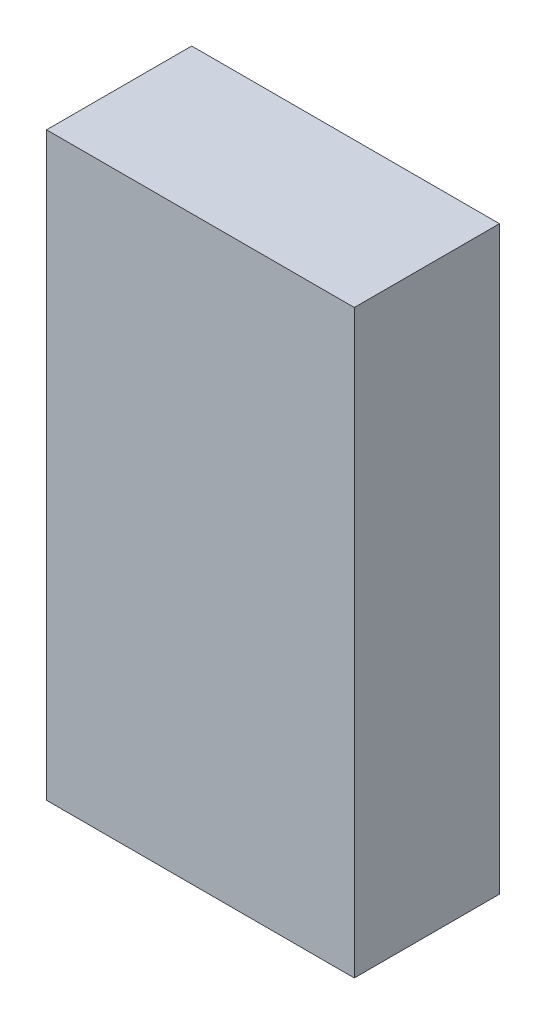
ISO-10303-21;
HEADER;
FILE_DESCRIPTION(('STEP AP214'),'2;1');
FILE_NAME('part.step','',(''),(''),'','','');
FILE_SCHEMA(('AUTOMOTIVE_DESIGN { 1 0 10303 214 1 1 1 1 }'));
ENDSEC;
DATA;
#1=APPLICATION_CONTEXT('core data for automotive mechanical design processes');
#2=APPLICATION_PROTOCOL_DEFINITION('international standard','automotive_design',2000,#1);
#3=PRODUCT_CONTEXT('',#1,'mechanical');
#4=PRODUCT('Part','Part','',(#3));
#5=PRODUCT_RELATED_PRODUCT_CATEGORY('part','',(#4));
#6=PRODUCT_DEFINITION_FORMATION('','',#4);
#7=PRODUCT_DEFINITION_CONTEXT('part definition',#1,'design');
#8=PRODUCT_DEFINITION('design','',#6,#7);
#9=PRODUCT_DEFINITION_SHAPE('','',#8);
#10=(LENGTH_UNIT() NAMED_UNIT(*) SI_UNIT(.MILLI.,.METRE.));
#11=(NAMED_UNIT(*) PLANE_ANGLE_UNIT() SI_UNIT($,.RADIAN.));
#12=(NAMED_UNIT(*) SI_UNIT($,.STERADIAN.) SOLID_ANGLE_UNIT());
#13=UNCERTAINTY_MEASURE_WITH_UNIT(LENGTH_MEASURE(1.E-05),#10,'distance_accuracy_value','');
#14=(GEOMETRIC_REPRESENTATION_CONTEXT(3) GLOBAL_UNCERTAINTY_ASSIGNED_CONTEXT((#13)) GLOBAL_UNIT_ASSIGNED_CONTEXT((#10,
#11,#12)) REPRESENTATION_CONTEXT('',''));
#15=CARTESIAN_POINT('',(0.,0.,0.));
#16=DIRECTION('',(0.,0.,1.));
#17=DIRECTION('',(1.,0.,0.));
#18=AXIS2_PLACEMENT_3D('',#15,#16,#17);
#19=CARTESIAN_POINT('',(52.9999999999999,200.,-22.5));
#20=DIRECTION('',(-1.,0.,0.));
#21=DIRECTION('',(0.,0.,1.));
#22=AXIS2_PLACEMENT_3D('',#19,#20,#21);
#23=PLANE('',#22);
#24=DIRECTION('',(0.,0.,-1.));
#25=VECTOR('',#24,1.);
#26=CARTESIAN_POINT('',(52.9999999999999,0.,-22.5));
#27=LINE('',#26,#25);
#28=CARTESIAN_POINT('',(53.,0.,27.5));
#29=VERTEX_POINT('',#28);
#30=CARTESIAN_POINT('',(52.9999999999999,0.,-22.5));
#31=VERTEX_POINT('',#30);
#32=EDGE_CURVE('E139',#29,#31,#27,.T.);
#33=ORIENTED_EDGE('',*,*,#32,.T.);
#34=DIRECTION('',(0.,-1.,0.));
#35=VECTOR('',#34,1.);
#36=CARTESIAN_POINT('',(52.9999999999999,200.,-22.5));
#37=LINE('',#36,#35);
#38=CARTESIAN_POINT('',(52.9999999999999,200.,-22.5));
#39=VERTEX_POINT('',#38);
#40=EDGE_CURVE('E232',#39,#31,#37,.T.);
#41=ORIENTED_EDGE('',*,*,#40,.F.);
#42=DIRECTION('',(0.,0.,-1.));
#43=VECTOR('',#42,1.);
#44=CARTESIAN_POINT('',(52.9999999999999,200.,-22.5));
#45=LINE('',#44,#43);
#46=CARTESIAN_POINT('',(53.,200.,27.5));
#47=VERTEX_POINT('',#46);
#48=EDGE_CURVE('E132',#47,#39,#45,.T.);
#49=ORIENTED_EDGE('',*,*,#48,.F.);
#50=DIRECTION('',(0.,1.,0.));
#51=VECTOR('',#50,1.);
#52=CARTESIAN_POINT('',(53.,200.,27.5));
#53=LINE('',#52,#51);
#54=EDGE_CURVE('E143',#29,#47,#53,.T.);
#55=ORIENTED_EDGE('',*,*,#54,.F.);
#56=EDGE_LOOP('',(#33,#41,#49,#55));
#57=FACE_BOUND('',#56,.T.);
#58=ADVANCED_FACE('F33',(#57),#23,.F.);
#59=CARTESIAN_POINT('',(-53.0000000000001,200.,-22.5));
#60=DIRECTION('',(0.,0.,1.));
#61=DIRECTION('',(1.,0.,0.));
#62=AXIS2_PLACEMENT_3D('',#59,#60,#61);
#63=PLANE('',#62);
#64=CARTESIAN_POINT('',(-1.69657033206363,150.301958836192,-22.5));
#65=DIRECTION('',(0.,0.,1.));
#66=DIRECTION('',(1.,0.,0.));
#67=AXIS2_PLACEMENT_3D('',#64,#65,#66);
#68=CIRCLE('',#67,7.5);
#69=CARTESIAN_POINT('',(5.80342966793638,150.301958836192,-22.5));
#70=VERTEX_POINT('',#69);
#71=EDGE_CURVE('E170',#70,#70,#68,.T.);
#72=ORIENTED_EDGE('',*,*,#71,.T.);
#73=EDGE_LOOP('',(#72));
#74=FACE_BOUND('',#73,.T.);
#75=CARTESIAN_POINT('',(23.3034296679364,150.301958836192,-22.5));
#76=DIRECTION('',(0.,0.,1.));
#77=DIRECTION('',(1.,0.,0.));
#78=AXIS2_PLACEMENT_3D('',#75,#76,#77);
#79=CIRCLE('',#78,7.5);
#80=CARTESIAN_POINT('',(30.8034296679364,150.301958836192,-22.5));
#81=VERTEX_POINT('',#80);
#82=EDGE_CURVE('E177',#81,#81,#79,.T.);
#83=ORIENTED_EDGE('',*,*,#82,.T.);
#84=EDGE_LOOP('',(#83));
#85=FACE_BOUND('',#84,.T.);
#86=CARTESIAN_POINT('',(-26.6965703320636,150.301958836192,-22.5));
#87=DIRECTION('',(0.,0.,1.));
#88=DIRECTION('',(1.,0.,0.));
#89=AXIS2_PLACEMENT_3D('',#86,#87,#88);
#90=CIRCLE('',#89,7.5);
#91=CARTESIAN_POINT('',(-19.1965703320636,150.301958836192,-22.5));
#92=VERTEX_POINT('',#91);
#93=EDGE_CURVE('E182',#92,#92,#90,.T.);
#94=ORIENTED_EDGE('',*,*,#93,.T.);
#95=EDGE_LOOP('',(#94));
#96=FACE_BOUND('',#95,.T.);
#97=DIRECTION('',(-1.,0.,0.));
#98=VECTOR('',#97,1.);
#99=CARTESIAN_POINT('',(-53.0000000000001,0.,-22.5));
#100=LINE('',#99,#98);
#101=CARTESIAN_POINT('',(-53.0000000000001,0.,-22.5));
#102=VERTEX_POINT('',#101);
#103=EDGE_CURVE('E133',#31,#102,#100,.T.);
#104=ORIENTED_EDGE('',*,*,#103,.T.);
#105=DIRECTION('',(0.,-1.,0.));
#106=VECTOR('',#105,1.);
#107=CARTESIAN_POINT('',(-53.0000000000001,200.,-22.5));
#108=LINE('',#107,#106);
#109=CARTESIAN_POINT('',(-53.0000000000001,200.,-22.5));
#110=VERTEX_POINT('',#109);
#111=EDGE_CURVE('E130',#110,#102,#108,.T.);
#112=ORIENTED_EDGE('',*,*,#111,.F.);
#113=DIRECTION('',(-1.,0.,0.));
#114=VECTOR('',#113,1.);
#115=CARTESIAN_POINT('',(-53.0000000000001,200.,-22.5));
#116=LINE('',#115,#114);
#117=EDGE_CURVE('E225',#39,#110,#116,.T.);
#118=ORIENTED_EDGE('',*,*,#117,.F.);
#119=ORIENTED_EDGE('',*,*,#40,.T.);
#120=EDGE_LOOP('',(#104,#112,#118,#119));
#121=FACE_BOUND('',#120,.T.);
#122=ADVANCED_FACE('F269',(#74,#85,#96,#121),#63,.F.);
#123=CARTESIAN_POINT('',(-53.0000000000001,200.,-22.5));
#124=DIRECTION('',(1.,0.,0.));
#125=DIRECTION('',(0.,0.,-1.));
#126=AXIS2_PLACEMENT_3D('',#123,#124,#125);
#127=PLANE('',#126);
#128=DIRECTION('',(0.,0.,1.));
#129=VECTOR('',#128,1.);
#130=CARTESIAN_POINT('',(-53.0000000000001,0.,-22.5));
#131=LINE('',#130,#129);
#132=CARTESIAN_POINT('',(-53.,0.,27.5));
#133=VERTEX_POINT('',#132);
#134=EDGE_CURVE('E123',#102,#133,#131,.T.);
#135=ORIENTED_EDGE('',*,*,#134,.T.);
#136=DIRECTION('',(0.,-1.,0.));
#137=VECTOR('',#136,1.);
#138=CARTESIAN_POINT('',(-53.,200.,27.5));
#139=LINE('',#138,#137);
#140=CARTESIAN_POINT('',(-53.,200.,27.5));
#141=VERTEX_POINT('',#140);
#142=EDGE_CURVE('E128',#141,#133,#139,.T.);
#143=ORIENTED_EDGE('',*,*,#142,.F.);
#144=DIRECTION('',(0.,0.,1.));
#145=VECTOR('',#144,1.);
#146=CARTESIAN_POINT('',(-53.0000000000001,200.,-22.5));
#147=LINE('',#146,#145);
#148=EDGE_CURVE('E227',#110,#141,#147,.T.);
#149=ORIENTED_EDGE('',*,*,#148,.F.);
#150=ORIENTED_EDGE('',*,*,#111,.T.);
#151=EDGE_LOOP('',(#135,#143,#149,#150));
#152=FACE_BOUND('',#151,.T.);
#153=ADVANCED_FACE('F125',(#152),#127,.F.);
#154=CARTESIAN_POINT('',(0.,200.,0.));
#155=DIRECTION('',(0.,1.,0.));
#156=DIRECTION('',(0.,0.,1.));
#157=AXIS2_PLACEMENT_3D('',#154,#155,#156);
#158=PLANE('',#157);
#159=ORIENTED_EDGE('',*,*,#48,.T.);
#160=ORIENTED_EDGE('',*,*,#117,.T.);
#161=ORIENTED_EDGE('',*,*,#148,.T.);
#162=DIRECTION('',(-1.,0.,0.));
#163=VECTOR('',#162,1.);
#164=CARTESIAN_POINT('',(-53.,200.,27.5));
#165=LINE('',#164,#163);
#166=EDGE_CURVE('E148',#47,#141,#165,.T.);
#167=ORIENTED_EDGE('',*,*,#166,.F.);
#168=EDGE_LOOP('',(#159,#160,#161,#167));
#169=FACE_BOUND('',#168,.T.);
#170=ADVANCED_FACE('F279',(#169),#158,.T.);
#171=CARTESIAN_POINT('',(0.,0.,0.));
#172=DIRECTION('',(0.,1.,0.));
#173=DIRECTION('',(0.,0.,1.));
#174=AXIS2_PLACEMENT_3D('',#171,#172,#173);
#175=PLANE('',#174);
#176=DIRECTION('',(1.,0.,0.));
#177=VECTOR('',#176,1.);
#178=CARTESIAN_POINT('',(-33.0000000000001,0.,7.29204172876375));
#179=LINE('',#178,#177);
#180=CARTESIAN_POINT('',(-33.0000000000001,0.,7.29204172876375));
#181=VERTEX_POINT('',#180);
#182=CARTESIAN_POINT('',(-8.96940793930368,0.,7.29204172876375));
#183=VERTEX_POINT('',#182);
#184=EDGE_CURVE('E154',#181,#183,#179,.T.);
#185=ORIENTED_EDGE('',*,*,#184,.F.);
#186=DIRECTION('',(0.,0.,-1.));
#187=VECTOR('',#186,1.);
#188=CARTESIAN_POINT('',(-33.0000000000001,0.,14.5));
#189=LINE('',#188,#187);
#190=CARTESIAN_POINT('',(-33.0000000000001,0.,14.5));
#191=VERTEX_POINT('',#190);
#192=EDGE_CURVE('E47',#191,#181,#189,.T.);
#193=ORIENTED_EDGE('',*,*,#192,.F.);
#194=DIRECTION('',(-1.,0.,0.));
#195=VECTOR('',#194,1.);
#196=CARTESIAN_POINT('',(-33.0000000000001,0.,14.5));
#197=LINE('',#196,#195);
#198=CARTESIAN_POINT('',(-8.96940793930368,0.,14.5));
#199=VERTEX_POINT('',#198);
#200=EDGE_CURVE('E159',#199,#191,#197,.T.);
#201=ORIENTED_EDGE('',*,*,#200,.F.);
#202=DIRECTION('',(0.,0.,1.));
#203=VECTOR('',#202,1.);
#204=CARTESIAN_POINT('',(-8.96940793930368,0.,14.5));
#205=LINE('',#204,#203);
#206=EDGE_CURVE('E156',#183,#199,#205,.T.);
#207=ORIENTED_EDGE('',*,*,#206,.F.);
#208=EDGE_LOOP('',(#185,#193,#201,#207));
#209=FACE_BOUND('',#208,.T.);
#210=ORIENTED_EDGE('',*,*,#32,.F.);
#211=DIRECTION('',(1.,0.,0.));
#212=VECTOR('',#211,1.);
#213=CARTESIAN_POINT('',(-53.,0.,27.5));
#214=LINE('',#213,#212);
#215=EDGE_CURVE('E136',#133,#29,#214,.T.);
#216=ORIENTED_EDGE('',*,*,#215,.F.);
#217=ORIENTED_EDGE('',*,*,#134,.F.);
#218=ORIENTED_EDGE('',*,*,#103,.F.);
#219=EDGE_LOOP('',(#210,#216,#217,#218));
#220=FACE_BOUND('',#219,.T.);
#221=ADVANCED_FACE('F137',(#209,#220),#175,.F.);
#222=CARTESIAN_POINT('',(-43.,190.,-12.4999999999999));
#223=DIRECTION('',(-1.,0.,0.));
#224=DIRECTION('',(0.,-1.,0.));
#225=AXIS2_PLACEMENT_3D('',#222,#223,#224);
#226=PLANE('',#225);
#227=DIRECTION('',(0.,-1.,0.));
#228=VECTOR('',#227,1.);
#229=CARTESIAN_POINT('',(-43.,190.,22.5));
#230=LINE('',#229,#228);
#231=CARTESIAN_POINT('',(-43.,190.,22.5));
#232=VERTEX_POINT('',#231);
#233=CARTESIAN_POINT('',(-43.,10.,22.5));
#234=VERTEX_POINT('',#233);
#235=EDGE_CURVE('E185',#232,#234,#230,.T.);
#236=ORIENTED_EDGE('',*,*,#235,.T.);
#237=DIRECTION('',(0.,0.,1.));
#238=VECTOR('',#237,1.);
#239=CARTESIAN_POINT('',(-43.,10.,-12.4999999999999));
#240=LINE('',#239,#238);
#241=CARTESIAN_POINT('',(-43.,10.,-12.4999999999999));
#242=VERTEX_POINT('',#241);
#243=EDGE_CURVE('E201',#242,#234,#240,.T.);
#244=ORIENTED_EDGE('',*,*,#243,.F.);
#245=DIRECTION('',(0.,-1.,0.));
#246=VECTOR('',#245,1.);
#247=CARTESIAN_POINT('',(-43.,190.,-12.4999999999999));
#248=LINE('',#247,#246);
#249=CARTESIAN_POINT('',(-43.,190.,-12.4999999999999));
#250=VERTEX_POINT('',#249);
#251=EDGE_CURVE('E188',#250,#242,#248,.T.);
#252=ORIENTED_EDGE('',*,*,#251,.F.);
#253=DIRECTION('',(0.,0.,1.));
#254=VECTOR('',#253,1.);
#255=CARTESIAN_POINT('',(-43.,190.,-12.4999999999999));
#256=LINE('',#255,#254);
#257=EDGE_CURVE('E212',#250,#232,#256,.T.);
#258=ORIENTED_EDGE('',*,*,#257,.T.);
#259=EDGE_LOOP('',(#236,#244,#252,#258));
#260=FACE_BOUND('',#259,.T.);
#261=ADVANCED_FACE('F286',(#260),#226,.F.);
#262=CARTESIAN_POINT('',(-43.,190.,-12.4999999999999));
#263=DIRECTION('',(0.,1.,0.));
#264=DIRECTION('',(0.,0.,1.));
#265=AXIS2_PLACEMENT_3D('',#262,#263,#264);
#266=PLANE('',#265);
#267=DIRECTION('',(-1.,0.,0.));
#268=VECTOR('',#267,1.);
#269=CARTESIAN_POINT('',(-43.,190.,22.5));
#270=LINE('',#269,#268);
#271=CARTESIAN_POINT('',(43.,190.,22.5));
#272=VERTEX_POINT('',#271);
#273=EDGE_CURVE('E192',#272,#232,#270,.T.);
#274=ORIENTED_EDGE('',*,*,#273,.T.);
#275=ORIENTED_EDGE('',*,*,#257,.F.);
#276=DIRECTION('',(-1.,0.,0.));
#277=VECTOR('',#276,1.);
#278=CARTESIAN_POINT('',(-43.,190.,-12.4999999999999));
#279=LINE('',#278,#277);
#280=CARTESIAN_POINT('',(43.,190.,-12.4999999999999));
#281=VERTEX_POINT('',#280);
#282=EDGE_CURVE('E198',#281,#250,#279,.T.);
#283=ORIENTED_EDGE('',*,*,#282,.F.);
#284=DIRECTION('',(0.,0.,1.));
#285=VECTOR('',#284,1.);
#286=CARTESIAN_POINT('',(43.,190.,-12.4999999999999));
#287=LINE('',#286,#285);
#288=EDGE_CURVE('E215',#281,#272,#287,.T.);
#289=ORIENTED_EDGE('',*,*,#288,.T.);
#290=EDGE_LOOP('',(#274,#275,#283,#289));
#291=FACE_BOUND('',#290,.T.);
#292=ADVANCED_FACE('F292',(#291),#266,.F.);
#293=CARTESIAN_POINT('',(43.,190.,-12.4999999999999));
#294=DIRECTION('',(1.,0.,0.));
#295=DIRECTION('',(0.,1.,0.));
#296=AXIS2_PLACEMENT_3D('',#293,#294,#295);
#297=PLANE('',#296);
#298=DIRECTION('',(0.,1.,0.));
#299=VECTOR('',#298,1.);
#300=CARTESIAN_POINT('',(43.,190.,22.5));
#301=LINE('',#300,#299);
#302=CARTESIAN_POINT('',(43.,10.,22.5));
#303=VERTEX_POINT('',#302);
#304=EDGE_CURVE('E207',#303,#272,#301,.T.);
#305=ORIENTED_EDGE('',*,*,#304,.T.);
#306=ORIENTED_EDGE('',*,*,#288,.F.);
#307=DIRECTION('',(0.,1.,0.));
#308=VECTOR('',#307,1.);
#309=CARTESIAN_POINT('',(43.,190.,-12.4999999999999));
#310=LINE('',#309,#308);
#311=CARTESIAN_POINT('',(43.,10.,-12.4999999999999));
#312=VERTEX_POINT('',#311);
#313=EDGE_CURVE('E195',#312,#281,#310,.T.);
#314=ORIENTED_EDGE('',*,*,#313,.F.);
#315=DIRECTION('',(0.,0.,1.));
#316=VECTOR('',#315,1.);
#317=CARTESIAN_POINT('',(43.,10.,-12.4999999999999));
#318=LINE('',#317,#316);
#319=EDGE_CURVE('E218',#312,#303,#318,.T.);
#320=ORIENTED_EDGE('',*,*,#319,.T.);
#321=EDGE_LOOP('',(#305,#306,#314,#320));
#322=FACE_BOUND('',#321,.T.);
#323=ADVANCED_FACE('F297',(#322),#297,.F.);
#324=CARTESIAN_POINT('',(-43.,10.,-12.4999999999999));
#325=DIRECTION('',(0.,-1.,0.));
#326=DIRECTION('',(0.,0.,-1.));
#327=AXIS2_PLACEMENT_3D('',#324,#325,#326);
#328=PLANE('',#327);
#329=DIRECTION('',(-1.,0.,0.));
#330=VECTOR('',#329,1.);
#331=CARTESIAN_POINT('',(-43.,10.,14.5));
#332=LINE('',#331,#330);
#333=CARTESIAN_POINT('',(-8.96940793930368,10.,14.5));
#334=VERTEX_POINT('',#333);
#335=CARTESIAN_POINT('',(-33.0000000000001,10.,14.5));
#336=VERTEX_POINT('',#335);
#337=EDGE_CURVE('E40',#334,#336,#332,.T.);
#338=ORIENTED_EDGE('',*,*,#337,.T.);
#339=DIRECTION('',(0.,0.,-1.));
#340=VECTOR('',#339,1.);
#341=CARTESIAN_POINT('',(-33.0000000000001,10.,-12.4999999999999));
#342=LINE('',#341,#340);
#343=CARTESIAN_POINT('',(-33.0000000000001,10.,7.29204172876375));
#344=VERTEX_POINT('',#343);
#345=EDGE_CURVE('E11',#336,#344,#342,.T.);
#346=ORIENTED_EDGE('',*,*,#345,.T.);
#347=DIRECTION('',(1.,0.,0.));
#348=VECTOR('',#347,1.);
#349=CARTESIAN_POINT('',(-43.,10.,7.29204172876375));
#350=LINE('',#349,#348);
#351=CARTESIAN_POINT('',(-8.96940793930368,10.,7.29204172876375));
#352=VERTEX_POINT('',#351);
#353=EDGE_CURVE('E235',#344,#352,#350,.T.);
#354=ORIENTED_EDGE('',*,*,#353,.T.);
#355=DIRECTION('',(0.,0.,1.));
#356=VECTOR('',#355,1.);
#357=CARTESIAN_POINT('',(-8.96940793930368,10.,-12.4999999999999));
#358=LINE('',#357,#356);
#359=EDGE_CURVE('E238',#352,#334,#358,.T.);
#360=ORIENTED_EDGE('',*,*,#359,.T.);
#361=EDGE_LOOP('',(#338,#346,#354,#360));
#362=FACE_BOUND('',#361,.T.);
#363=DIRECTION('',(1.,0.,0.));
#364=VECTOR('',#363,1.);
#365=CARTESIAN_POINT('',(-43.,10.,22.5));
#366=LINE('',#365,#364);
#367=EDGE_CURVE('E204',#234,#303,#366,.T.);
#368=ORIENTED_EDGE('',*,*,#367,.T.);
#369=ORIENTED_EDGE('',*,*,#319,.F.);
#370=DIRECTION('',(1.,0.,0.));
#371=VECTOR('',#370,1.);
#372=CARTESIAN_POINT('',(-43.,10.,-12.4999999999999));
#373=LINE('',#372,#371);
#374=EDGE_CURVE('E191',#242,#312,#373,.T.);
#375=ORIENTED_EDGE('',*,*,#374,.F.);
#376=ORIENTED_EDGE('',*,*,#243,.T.);
#377=EDGE_LOOP('',(#368,#369,#375,#376));
#378=FACE_BOUND('',#377,.T.);
#379=ADVANCED_FACE('F242',(#362,#378),#328,.F.);
#380=CARTESIAN_POINT('',(0.,0.,-12.4999999999999));
#381=DIRECTION('',(0.,0.,1.));
#382=DIRECTION('',(1.,0.,0.));
#383=AXIS2_PLACEMENT_3D('',#380,#381,#382);
#384=PLANE('',#383);
#385=CARTESIAN_POINT('',(-1.69657033206363,150.301958836192,-12.4999999999999));
#386=DIRECTION('',(0.,0.,1.));
#387=DIRECTION('',(1.,0.,0.));
#388=AXIS2_PLACEMENT_3D('',#385,#386,#387);
#389=CIRCLE('',#388,7.5);
#390=CARTESIAN_POINT('',(5.80342966793638,150.301958836192,-12.4999999999999));
#391=VERTEX_POINT('',#390);
#392=EDGE_CURVE('E174',#391,#391,#389,.T.);
#393=ORIENTED_EDGE('',*,*,#392,.F.);
#394=EDGE_LOOP('',(#393));
#395=FACE_BOUND('',#394,.T.);
#396=CARTESIAN_POINT('',(23.3034296679364,150.301958836192,-12.4999999999999));
#397=DIRECTION('',(0.,0.,1.));
#398=DIRECTION('',(1.,0.,0.));
#399=AXIS2_PLACEMENT_3D('',#396,#397,#398);
#400=CIRCLE('',#399,7.5);
#401=CARTESIAN_POINT('',(30.8034296679364,150.301958836192,-12.4999999999999));
#402=VERTEX_POINT('',#401);
#403=EDGE_CURVE('E165',#402,#402,#400,.T.);
#404=ORIENTED_EDGE('',*,*,#403,.F.);
#405=EDGE_LOOP('',(#404));
#406=FACE_BOUND('',#405,.T.);
#407=CARTESIAN_POINT('',(-26.6965703320636,150.301958836192,-12.4999999999999));
#408=DIRECTION('',(0.,0.,1.));
#409=DIRECTION('',(1.,0.,0.));
#410=AXIS2_PLACEMENT_3D('',#407,#408,#409);
#411=CIRCLE('',#410,7.5);
#412=CARTESIAN_POINT('',(-19.1965703320636,150.301958836192,-12.4999999999999));
#413=VERTEX_POINT('',#412);
#414=EDGE_CURVE('E173',#413,#413,#411,.T.);
#415=ORIENTED_EDGE('',*,*,#414,.F.);
#416=EDGE_LOOP('',(#415));
#417=FACE_BOUND('',#416,.T.);
#418=ORIENTED_EDGE('',*,*,#251,.T.);
#419=ORIENTED_EDGE('',*,*,#374,.T.);
#420=ORIENTED_EDGE('',*,*,#313,.T.);
#421=ORIENTED_EDGE('',*,*,#282,.T.);
#422=EDGE_LOOP('',(#418,#419,#420,#421));
#423=FACE_BOUND('',#422,.T.);
#424=ADVANCED_FACE('F296',(#395,#406,#417,#423),#384,.T.);
#425=CARTESIAN_POINT('',(-26.6965703320636,150.301958836192,-22.5));
#426=DIRECTION('',(0.,0.,1.));
#427=DIRECTION('',(1.,0.,0.));
#428=AXIS2_PLACEMENT_3D('',#425,#426,#427);
#429=CYLINDRICAL_SURFACE('',#428,7.5);
#430=ORIENTED_EDGE('',*,*,#93,.F.);
#431=EDGE_LOOP('',(#430));
#432=FACE_BOUND('',#431,.T.);
#433=ORIENTED_EDGE('',*,*,#414,.T.);
#434=EDGE_LOOP('',(#433));
#435=FACE_BOUND('',#434,.T.);
#436=ADVANCED_FACE('F306',(#432,#435),#429,.F.);
#437=CARTESIAN_POINT('',(23.3034296679364,150.301958836192,-22.5));
#438=DIRECTION('',(0.,0.,1.));
#439=DIRECTION('',(1.,0.,0.));
#440=AXIS2_PLACEMENT_3D('',#437,#438,#439);
#441=CYLINDRICAL_SURFACE('',#440,7.5);
#442=ORIENTED_EDGE('',*,*,#82,.F.);
#443=EDGE_LOOP('',(#442));
#444=FACE_BOUND('',#443,.T.);
#445=ORIENTED_EDGE('',*,*,#403,.T.);
#446=EDGE_LOOP('',(#445));
#447=FACE_BOUND('',#446,.T.);
#448=ADVANCED_FACE('F264',(#444,#447),#441,.F.);
#449=CARTESIAN_POINT('',(-1.69657033206363,150.301958836192,-22.5));
#450=DIRECTION('',(0.,0.,1.));
#451=DIRECTION('',(1.,0.,0.));
#452=AXIS2_PLACEMENT_3D('',#449,#450,#451);
#453=CYLINDRICAL_SURFACE('',#452,7.5);
#454=ORIENTED_EDGE('',*,*,#71,.F.);
#455=EDGE_LOOP('',(#454));
#456=FACE_BOUND('',#455,.T.);
#457=ORIENTED_EDGE('',*,*,#392,.T.);
#458=EDGE_LOOP('',(#457));
#459=FACE_BOUND('',#458,.T.);
#460=ADVANCED_FACE('F257',(#456,#459),#453,.F.);
#461=CARTESIAN_POINT('',(-33.0000000000001,35.,14.5));
#462=DIRECTION('',(-1.,0.,0.));
#463=DIRECTION('',(0.,0.,1.));
#464=AXIS2_PLACEMENT_3D('',#461,#462,#463);
#465=PLANE('',#464);
#466=DIRECTION('',(0.,-1.,0.));
#467=VECTOR('',#466,1.);
#468=CARTESIAN_POINT('',(-33.0000000000001,35.,14.5));
#469=LINE('',#468,#467);
#470=EDGE_CURVE('E163',#336,#191,#469,.T.);
#471=ORIENTED_EDGE('',*,*,#470,.T.);
#472=ORIENTED_EDGE('',*,*,#192,.T.);
#473=DIRECTION('',(0.,-1.,0.));
#474=VECTOR('',#473,1.);
#475=CARTESIAN_POINT('',(-33.0000000000001,35.,7.29204172876375));
#476=LINE('',#475,#474);
#477=EDGE_CURVE('E162',#344,#181,#476,.T.);
#478=ORIENTED_EDGE('',*,*,#477,.F.);
#479=ORIENTED_EDGE('',*,*,#345,.F.);
#480=EDGE_LOOP('',(#471,#472,#478,#479));
#481=FACE_BOUND('',#480,.T.);
#482=ADVANCED_FACE('F255',(#481),#465,.F.);
#483=CARTESIAN_POINT('',(-33.0000000000001,35.,14.5));
#484=DIRECTION('',(0.,0.,1.));
#485=DIRECTION('',(1.,0.,0.));
#486=AXIS2_PLACEMENT_3D('',#483,#484,#485);
#487=PLANE('',#486);
#488=DIRECTION('',(0.,-1.,0.));
#489=VECTOR('',#488,1.);
#490=CARTESIAN_POINT('',(-8.96940793930368,35.,14.5));
#491=LINE('',#490,#489);
#492=EDGE_CURVE('E166',#334,#199,#491,.T.);
#493=ORIENTED_EDGE('',*,*,#492,.T.);
#494=ORIENTED_EDGE('',*,*,#200,.T.);
#495=ORIENTED_EDGE('',*,*,#470,.F.);
#496=ORIENTED_EDGE('',*,*,#337,.F.);
#497=EDGE_LOOP('',(#493,#494,#495,#496));
#498=FACE_BOUND('',#497,.T.);
#499=ADVANCED_FACE('F247',(#498),#487,.F.);
#500=CARTESIAN_POINT('',(-8.96940793930368,35.,14.5));
#501=DIRECTION('',(1.,0.,0.));
#502=DIRECTION('',(0.,0.,-1.));
#503=AXIS2_PLACEMENT_3D('',#500,#501,#502);
#504=PLANE('',#503);
#505=DIRECTION('',(0.,-1.,0.));
#506=VECTOR('',#505,1.);
#507=CARTESIAN_POINT('',(-8.96940793930368,35.,7.29204172876375));
#508=LINE('',#507,#506);
#509=EDGE_CURVE('E55',#352,#183,#508,.T.);
#510=ORIENTED_EDGE('',*,*,#509,.T.);
#511=ORIENTED_EDGE('',*,*,#206,.T.);
#512=ORIENTED_EDGE('',*,*,#492,.F.);
#513=ORIENTED_EDGE('',*,*,#359,.F.);
#514=EDGE_LOOP('',(#510,#511,#512,#513));
#515=FACE_BOUND('',#514,.T.);
#516=ADVANCED_FACE('F249',(#515),#504,.F.);
#517=CARTESIAN_POINT('',(-33.0000000000001,35.,7.29204172876375));
#518=DIRECTION('',(0.,0.,-1.));
#519=DIRECTION('',(-1.,0.,0.));
#520=AXIS2_PLACEMENT_3D('',#517,#518,#519);
#521=PLANE('',#520);
#522=ORIENTED_EDGE('',*,*,#477,.T.);
#523=ORIENTED_EDGE('',*,*,#184,.T.);
#524=ORIENTED_EDGE('',*,*,#509,.F.);
#525=ORIENTED_EDGE('',*,*,#353,.F.);
#526=EDGE_LOOP('',(#522,#523,#524,#525));
#527=FACE_BOUND('',#526,.T.);
#528=ADVANCED_FACE('F254',(#527),#521,.F.);
#529=CARTESIAN_POINT('',(0.,0.,22.5));
#530=DIRECTION('',(0.,0.,1.));
#531=DIRECTION('',(1.,0.,0.));
#532=AXIS2_PLACEMENT_3D('',#529,#530,#531);
#533=PLANE('',#532);
#534=ORIENTED_EDGE('',*,*,#367,.F.);
#535=ORIENTED_EDGE('',*,*,#235,.F.);
#536=ORIENTED_EDGE('',*,*,#273,.F.);
#537=ORIENTED_EDGE('',*,*,#304,.F.);
#538=EDGE_LOOP('',(#534,#535,#536,#537));
#539=FACE_BOUND('',#538,.T.);
#540=ADVANCED_FACE('F327',(#539),#533,.F.);
#541=CARTESIAN_POINT('',(0.,0.,27.5));
#542=DIRECTION('',(0.,0.,1.));
#543=DIRECTION('',(1.,0.,0.));
#544=AXIS2_PLACEMENT_3D('',#541,#542,#543);
#545=PLANE('',#544);
#546=ORIENTED_EDGE('',*,*,#142,.T.);
#547=ORIENTED_EDGE('',*,*,#215,.T.);
#548=ORIENTED_EDGE('',*,*,#54,.T.);
#549=ORIENTED_EDGE('',*,*,#166,.T.);
#550=EDGE_LOOP('',(#546,#547,#548,#549));
#551=FACE_BOUND('',#550,.T.);
#552=ADVANCED_FACE('F146',(#551),#545,.T.);
#553=CLOSED_SHELL('',(#58,#122,#153,#170,#221,#261,#292,#323,#379,#424,#436,#448,#460,#482,#499,
#516,#528,#540,#552));
#554=MANIFOLD_SOLID_BREP('B2',#553);
#555=ADVANCED_BREP_SHAPE_REPRESENTATION('',(#18,#554),#14);
#556=SHAPE_DEFINITION_REPRESENTATION(#9,#555);
ENDSEC;
END-ISO-10303-21;
